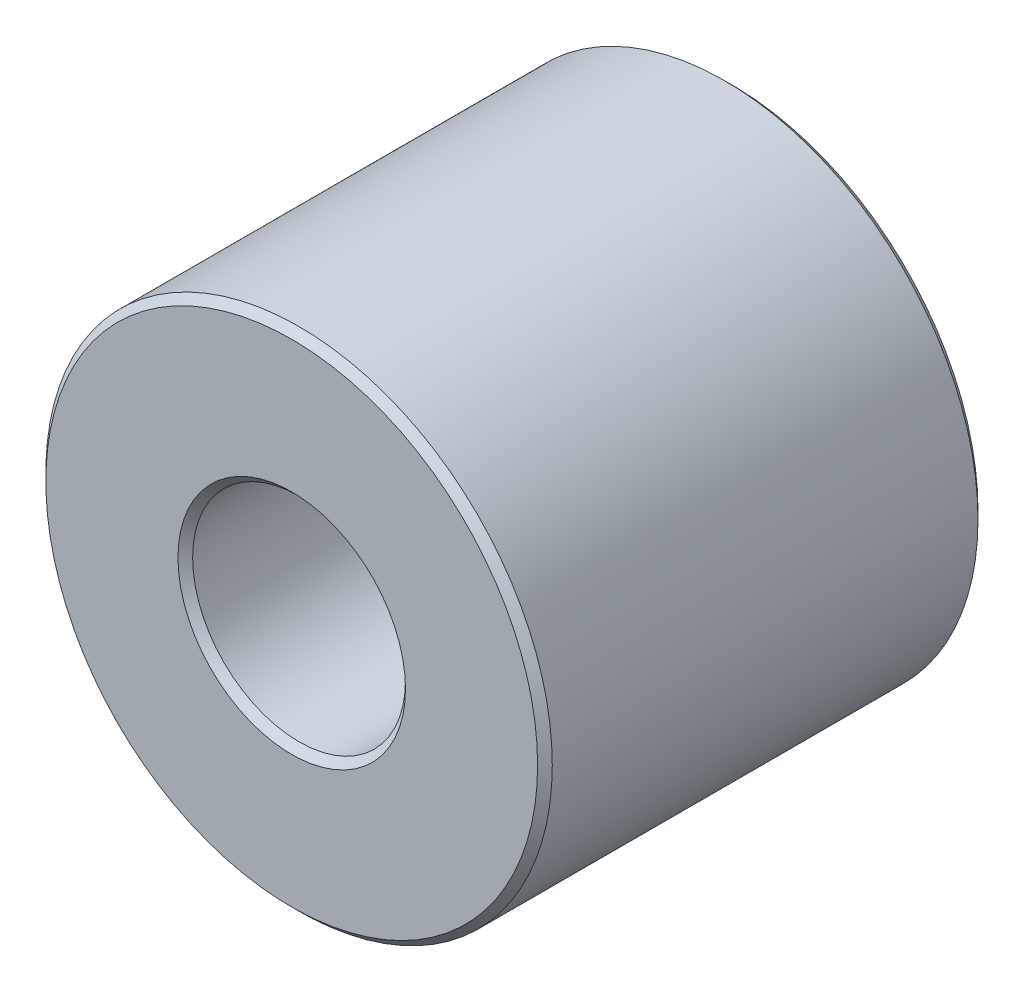
ISO-10303-21;
HEADER;
FILE_DESCRIPTION(('STEP AP214'),'2;1');
FILE_NAME('part.step','',(''),(''),'','','');
FILE_SCHEMA(('AUTOMOTIVE_DESIGN { 1 0 10303 214 1 1 1 1 }'));
ENDSEC;
DATA;
#1=APPLICATION_CONTEXT('core data for automotive mechanical design processes');
#2=APPLICATION_PROTOCOL_DEFINITION('international standard','automotive_design',2000,#1);
#3=PRODUCT_CONTEXT('',#1,'mechanical');
#4=PRODUCT('Part','Part','',(#3));
#5=PRODUCT_RELATED_PRODUCT_CATEGORY('part','',(#4));
#6=PRODUCT_DEFINITION_FORMATION('','',#4);
#7=PRODUCT_DEFINITION_CONTEXT('part definition',#1,'design');
#8=PRODUCT_DEFINITION('design','',#6,#7);
#9=PRODUCT_DEFINITION_SHAPE('','',#8);
#10=(LENGTH_UNIT() NAMED_UNIT(*) SI_UNIT(.MILLI.,.METRE.));
#11=(NAMED_UNIT(*) PLANE_ANGLE_UNIT() SI_UNIT($,.RADIAN.));
#12=(NAMED_UNIT(*) SI_UNIT($,.STERADIAN.) SOLID_ANGLE_UNIT());
#13=UNCERTAINTY_MEASURE_WITH_UNIT(LENGTH_MEASURE(1.E-05),#10,'distance_accuracy_value','');
#14=(GEOMETRIC_REPRESENTATION_CONTEXT(3) GLOBAL_UNCERTAINTY_ASSIGNED_CONTEXT((#13)) GLOBAL_UNIT_ASSIGNED_CONTEXT((#10,
#11,#12)) REPRESENTATION_CONTEXT('',''));
#15=CARTESIAN_POINT('',(0.,0.,0.));
#16=DIRECTION('',(0.,0.,1.));
#17=DIRECTION('',(1.,0.,0.));
#18=AXIS2_PLACEMENT_3D('',#15,#16,#17);
#19=CARTESIAN_POINT('',(0.,0.,6.));
#20=DIRECTION('',(0.,0.,1.));
#21=DIRECTION('',(1.,0.,0.));
#22=AXIS2_PLACEMENT_3D('',#19,#20,#21);
#23=PLANE('',#22);
#24=CARTESIAN_POINT('',(0.,0.,6.));
#25=DIRECTION('',(0.,0.,1.));
#26=DIRECTION('',(1.,0.,0.));
#27=AXIS2_PLACEMENT_3D('',#24,#25,#26);
#28=CIRCLE('',#27,1.55);
#29=CARTESIAN_POINT('',(1.55,0.,6.));
#30=VERTEX_POINT('',#29);
#31=EDGE_CURVE('E53',#30,#30,#28,.F.);
#32=ORIENTED_EDGE('',*,*,#31,.T.);
#33=EDGE_LOOP('',(#32));
#34=FACE_BOUND('',#33,.T.);
#35=CARTESIAN_POINT('',(0.,0.,6.));
#36=DIRECTION('',(0.,0.,1.));
#37=DIRECTION('',(1.,0.,0.));
#38=AXIS2_PLACEMENT_3D('',#35,#36,#37);
#39=CIRCLE('',#38,3.35);
#40=CARTESIAN_POINT('',(3.35,0.,6.));
#41=VERTEX_POINT('',#40);
#42=EDGE_CURVE('E58',#41,#41,#39,.T.);
#43=ORIENTED_EDGE('',*,*,#42,.T.);
#44=EDGE_LOOP('',(#43));
#45=FACE_BOUND('',#44,.T.);
#46=ADVANCED_FACE('F39',(#34,#45),#23,.T.);
#47=CARTESIAN_POINT('',(0.,0.,0.));
#48=DIRECTION('',(0.,0.,1.));
#49=DIRECTION('',(1.,0.,0.));
#50=AXIS2_PLACEMENT_3D('',#47,#48,#49);
#51=PLANE('',#50);
#52=CARTESIAN_POINT('',(0.,0.,0.));
#53=DIRECTION('',(0.,0.,1.));
#54=DIRECTION('',(1.,0.,0.));
#55=AXIS2_PLACEMENT_3D('',#52,#53,#54);
#56=CIRCLE('',#55,1.55);
#57=CARTESIAN_POINT('',(1.55,0.,0.));
#58=VERTEX_POINT('',#57);
#59=EDGE_CURVE('E72',#58,#58,#56,.T.);
#60=ORIENTED_EDGE('',*,*,#59,.T.);
#61=EDGE_LOOP('',(#60));
#62=FACE_BOUND('',#61,.T.);
#63=CARTESIAN_POINT('',(0.,0.,0.));
#64=DIRECTION('',(0.,0.,1.));
#65=DIRECTION('',(1.,0.,0.));
#66=AXIS2_PLACEMENT_3D('',#63,#64,#65);
#67=CIRCLE('',#66,3.35);
#68=CARTESIAN_POINT('',(3.35,0.,0.));
#69=VERTEX_POINT('',#68);
#70=EDGE_CURVE('E76',#69,#69,#67,.F.);
#71=ORIENTED_EDGE('',*,*,#70,.T.);
#72=EDGE_LOOP('',(#71));
#73=FACE_BOUND('',#72,.T.);
#74=ADVANCED_FACE('F81',(#62,#73),#51,.F.);
#75=CARTESIAN_POINT('',(0.,0.,6.));
#76=DIRECTION('',(0.,0.,-1.));
#77=DIRECTION('',(-1.,0.,0.));
#78=AXIS2_PLACEMENT_3D('',#75,#76,#77);
#79=CYLINDRICAL_SURFACE('',#78,3.45);
#80=CARTESIAN_POINT('',(0.,0.,0.0999999999999977));
#81=DIRECTION('',(0.,0.,1.));
#82=DIRECTION('',(1.,0.,0.));
#83=AXIS2_PLACEMENT_3D('',#80,#81,#82);
#84=CIRCLE('',#83,3.45);
#85=CARTESIAN_POINT('',(3.45,0.,0.0999999999999977));
#86=VERTEX_POINT('',#85);
#87=EDGE_CURVE('E10',#86,#86,#84,.T.);
#88=ORIENTED_EDGE('',*,*,#87,.T.);
#89=EDGE_LOOP('',(#88));
#90=FACE_BOUND('',#89,.T.);
#91=CARTESIAN_POINT('',(0.,0.,5.9));
#92=DIRECTION('',(0.,0.,1.));
#93=DIRECTION('',(1.,0.,0.));
#94=AXIS2_PLACEMENT_3D('',#91,#92,#93);
#95=CIRCLE('',#94,3.45);
#96=CARTESIAN_POINT('',(3.45,0.,5.9));
#97=VERTEX_POINT('',#96);
#98=EDGE_CURVE('E48',#97,#97,#95,.F.);
#99=ORIENTED_EDGE('',*,*,#98,.T.);
#100=EDGE_LOOP('',(#99));
#101=FACE_BOUND('',#100,.T.);
#102=ADVANCED_FACE('F102',(#90,#101),#79,.T.);
#103=CARTESIAN_POINT('',(0.,0.,6.));
#104=DIRECTION('',(0.,0.,-1.));
#105=DIRECTION('',(-1.,0.,0.));
#106=AXIS2_PLACEMENT_3D('',#103,#104,#105);
#107=CYLINDRICAL_SURFACE('',#106,1.45);
#108=CARTESIAN_POINT('',(0.,0.,0.1));
#109=DIRECTION('',(0.,0.,1.));
#110=DIRECTION('',(1.,0.,0.));
#111=AXIS2_PLACEMENT_3D('',#108,#109,#110);
#112=CIRCLE('',#111,1.45);
#113=CARTESIAN_POINT('',(1.45,0.,0.1));
#114=VERTEX_POINT('',#113);
#115=EDGE_CURVE('E64',#114,#114,#112,.F.);
#116=ORIENTED_EDGE('',*,*,#115,.T.);
#117=EDGE_LOOP('',(#116));
#118=FACE_BOUND('',#117,.T.);
#119=CARTESIAN_POINT('',(0.,0.,5.9));
#120=DIRECTION('',(0.,0.,1.));
#121=DIRECTION('',(1.,0.,0.));
#122=AXIS2_PLACEMENT_3D('',#119,#120,#121);
#123=CIRCLE('',#122,1.45);
#124=CARTESIAN_POINT('',(1.45,0.,5.9));
#125=VERTEX_POINT('',#124);
#126=EDGE_CURVE('E68',#125,#125,#123,.T.);
#127=ORIENTED_EDGE('',*,*,#126,.T.);
#128=EDGE_LOOP('',(#127));
#129=FACE_BOUND('',#128,.T.);
#130=ADVANCED_FACE('F107',(#118,#129),#107,.F.);
#131=CARTESIAN_POINT('',(0.,0.,0.));
#132=DIRECTION('',(0.,0.,-1.));
#133=DIRECTION('',(-1.,0.,0.));
#134=AXIS2_PLACEMENT_3D('',#131,#132,#133);
#135=CONICAL_SURFACE('',#134,1.55,0.785398163397447);
#136=ORIENTED_EDGE('',*,*,#115,.F.);
#137=EDGE_LOOP('',(#136));
#138=FACE_BOUND('',#137,.T.);
#139=ORIENTED_EDGE('',*,*,#59,.F.);
#140=EDGE_LOOP('',(#139));
#141=FACE_BOUND('',#140,.T.);
#142=ADVANCED_FACE('F92',(#138,#141),#135,.F.);
#143=CARTESIAN_POINT('',(0.,0.,5.9));
#144=DIRECTION('',(0.,0.,1.));
#145=DIRECTION('',(1.,0.,0.));
#146=AXIS2_PLACEMENT_3D('',#143,#144,#145);
#147=CONICAL_SURFACE('',#146,1.45,0.785398163397439);
#148=ORIENTED_EDGE('',*,*,#31,.F.);
#149=EDGE_LOOP('',(#148));
#150=FACE_BOUND('',#149,.T.);
#151=ORIENTED_EDGE('',*,*,#126,.F.);
#152=EDGE_LOOP('',(#151));
#153=FACE_BOUND('',#152,.T.);
#154=ADVANCED_FACE('F86',(#150,#153),#147,.F.);
#155=CARTESIAN_POINT('',(0.,0.,0.0999999999999977));
#156=DIRECTION('',(0.,0.,1.));
#157=DIRECTION('',(1.,0.,0.));
#158=AXIS2_PLACEMENT_3D('',#155,#156,#157);
#159=CONICAL_SURFACE('',#158,3.45,0.785398163397453);
#160=ORIENTED_EDGE('',*,*,#70,.F.);
#161=EDGE_LOOP('',(#160));
#162=FACE_BOUND('',#161,.T.);
#163=ORIENTED_EDGE('',*,*,#87,.F.);
#164=EDGE_LOOP('',(#163));
#165=FACE_BOUND('',#164,.T.);
#166=ADVANCED_FACE('F83',(#162,#165),#159,.T.);
#167=CARTESIAN_POINT('',(0.,0.,6.));
#168=DIRECTION('',(0.,0.,-1.));
#169=DIRECTION('',(-1.,0.,0.));
#170=AXIS2_PLACEMENT_3D('',#167,#168,#169);
#171=CONICAL_SURFACE('',#170,3.35,0.785398163397435);
#172=ORIENTED_EDGE('',*,*,#98,.F.);
#173=EDGE_LOOP('',(#172));
#174=FACE_BOUND('',#173,.T.);
#175=ORIENTED_EDGE('',*,*,#42,.F.);
#176=EDGE_LOOP('',(#175));
#177=FACE_BOUND('',#176,.T.);
#178=ADVANCED_FACE('F42',(#174,#177),#171,.T.);
#179=CLOSED_SHELL('',(#46,#74,#102,#130,#142,#154,#166,#178));
#180=MANIFOLD_SOLID_BREP('B2',#179);
#181=ADVANCED_BREP_SHAPE_REPRESENTATION('',(#18,#180),#14);
#182=SHAPE_DEFINITION_REPRESENTATION(#9,#181);
ENDSEC;
END-ISO-10303-21;
